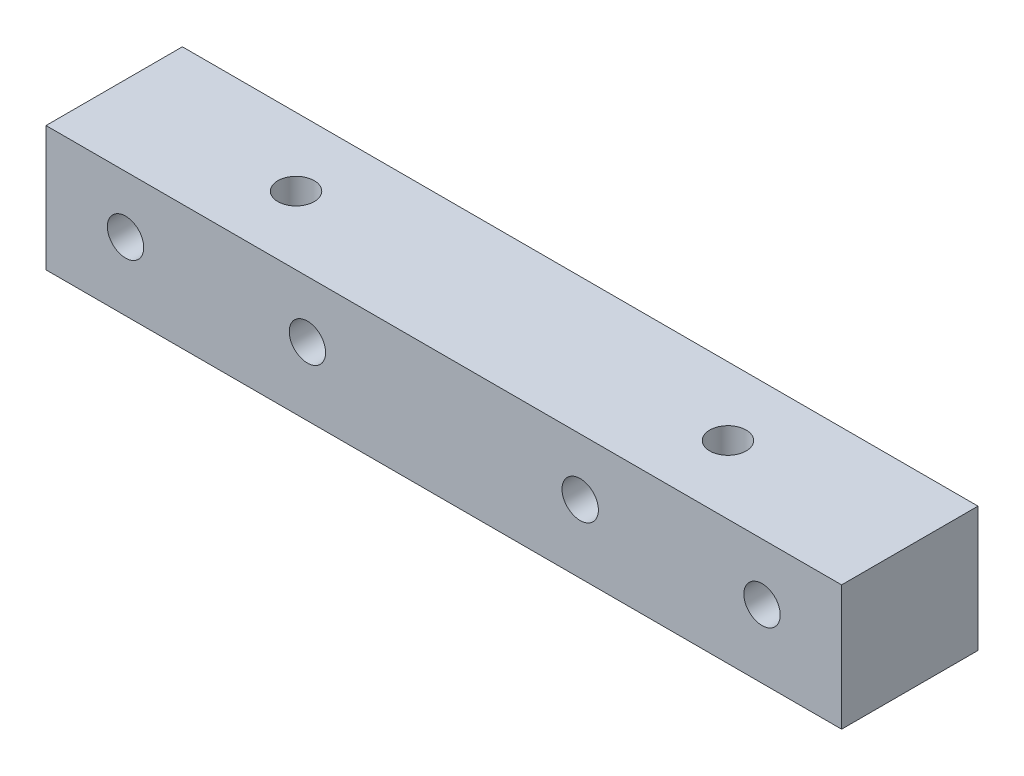
ISO-10303-21;
HEADER;
FILE_DESCRIPTION(('STEP AP214'),'2;1');
FILE_NAME('part.step','',(''),(''),'','','');
FILE_SCHEMA(('AUTOMOTIVE_DESIGN { 1 0 10303 214 1 1 1 1 }'));
ENDSEC;
DATA;
#1=APPLICATION_CONTEXT('core data for automotive mechanical design processes');
#2=APPLICATION_PROTOCOL_DEFINITION('international standard','automotive_design',2000,#1);
#3=PRODUCT_CONTEXT('',#1,'mechanical');
#4=PRODUCT('Part','Part','',(#3));
#5=PRODUCT_RELATED_PRODUCT_CATEGORY('part','',(#4));
#6=PRODUCT_DEFINITION_FORMATION('','',#4);
#7=PRODUCT_DEFINITION_CONTEXT('part definition',#1,'design');
#8=PRODUCT_DEFINITION('design','',#6,#7);
#9=PRODUCT_DEFINITION_SHAPE('','',#8);
#10=(LENGTH_UNIT() NAMED_UNIT(*) SI_UNIT(.MILLI.,.METRE.));
#11=(NAMED_UNIT(*) PLANE_ANGLE_UNIT() SI_UNIT($,.RADIAN.));
#12=(NAMED_UNIT(*) SI_UNIT($,.STERADIAN.) SOLID_ANGLE_UNIT());
#13=UNCERTAINTY_MEASURE_WITH_UNIT(LENGTH_MEASURE(1.E-05),#10,'distance_accuracy_value','');
#14=(GEOMETRIC_REPRESENTATION_CONTEXT(3) GLOBAL_UNCERTAINTY_ASSIGNED_CONTEXT((#13)) GLOBAL_UNIT_ASSIGNED_CONTEXT((#10,
#11,#12)) REPRESENTATION_CONTEXT('',''));
#15=CARTESIAN_POINT('',(0.,0.,0.));
#16=DIRECTION('',(0.,0.,1.));
#17=DIRECTION('',(1.,0.,0.));
#18=AXIS2_PLACEMENT_3D('',#15,#16,#17);
#19=CARTESIAN_POINT('',(-17.5,5.5,3.));
#20=DIRECTION('',(0.,0.,-1.));
#21=DIRECTION('',(-1.,0.,0.));
#22=AXIS2_PLACEMENT_3D('',#19,#20,#21);
#23=PLANE('',#22);
#24=CARTESIAN_POINT('',(6.,3.,3.));
#25=DIRECTION('',(0.,0.,1.));
#26=DIRECTION('',(1.,0.,0.));
#27=AXIS2_PLACEMENT_3D('',#24,#25,#26);
#28=CIRCLE('',#27,0.799999999999999);
#29=CARTESIAN_POINT('',(6.8,3.,3.));
#30=VERTEX_POINT('',#29);
#31=EDGE_CURVE('E132',#30,#30,#28,.T.);
#32=ORIENTED_EDGE('',*,*,#31,.F.);
#33=EDGE_LOOP('',(#32));
#34=FACE_BOUND('',#33,.T.);
#35=CARTESIAN_POINT('',(-14.,3.,3.));
#36=DIRECTION('',(0.,0.,1.));
#37=DIRECTION('',(1.,0.,0.));
#38=AXIS2_PLACEMENT_3D('',#35,#36,#37);
#39=CIRCLE('',#38,0.799999999999999);
#40=CARTESIAN_POINT('',(-13.2,3.,3.));
#41=VERTEX_POINT('',#40);
#42=EDGE_CURVE('E126',#41,#41,#39,.T.);
#43=ORIENTED_EDGE('',*,*,#42,.F.);
#44=EDGE_LOOP('',(#43));
#45=FACE_BOUND('',#44,.T.);
#46=DIRECTION('',(1.,0.,0.));
#47=VECTOR('',#46,1.);
#48=CARTESIAN_POINT('',(-17.5,0.,3.));
#49=LINE('',#48,#47);
#50=CARTESIAN_POINT('',(-17.5,0.,3.));
#51=VERTEX_POINT('',#50);
#52=CARTESIAN_POINT('',(17.5,0.,3.));
#53=VERTEX_POINT('',#52);
#54=EDGE_CURVE('E74',#51,#53,#49,.T.);
#55=ORIENTED_EDGE('',*,*,#54,.T.);
#56=DIRECTION('',(0.,-1.,0.));
#57=VECTOR('',#56,1.);
#58=CARTESIAN_POINT('',(17.5,5.5,3.));
#59=LINE('',#58,#57);
#60=CARTESIAN_POINT('',(17.5,5.5,3.));
#61=VERTEX_POINT('',#60);
#62=EDGE_CURVE('E94',#61,#53,#59,.T.);
#63=ORIENTED_EDGE('',*,*,#62,.F.);
#64=DIRECTION('',(1.,0.,0.));
#65=VECTOR('',#64,1.);
#66=CARTESIAN_POINT('',(-17.5,5.5,3.));
#67=LINE('',#66,#65);
#68=CARTESIAN_POINT('',(-17.5,5.5,3.));
#69=VERTEX_POINT('',#68);
#70=EDGE_CURVE('E51',#69,#61,#67,.T.);
#71=ORIENTED_EDGE('',*,*,#70,.F.);
#72=DIRECTION('',(0.,-1.,0.));
#73=VECTOR('',#72,1.);
#74=CARTESIAN_POINT('',(-17.5,5.5,3.));
#75=LINE('',#74,#73);
#76=EDGE_CURVE('E91',#69,#51,#75,.T.);
#77=ORIENTED_EDGE('',*,*,#76,.T.);
#78=EDGE_LOOP('',(#55,#63,#71,#77));
#79=FACE_BOUND('',#78,.T.);
#80=CARTESIAN_POINT('',(14.,3.,3.));
#81=DIRECTION('',(0.,0.,1.));
#82=DIRECTION('',(1.,0.,0.));
#83=AXIS2_PLACEMENT_3D('',#80,#81,#82);
#84=CIRCLE('',#83,0.799999999999999);
#85=CARTESIAN_POINT('',(14.8,3.,3.));
#86=VERTEX_POINT('',#85);
#87=EDGE_CURVE('E114',#86,#86,#84,.T.);
#88=ORIENTED_EDGE('',*,*,#87,.F.);
#89=EDGE_LOOP('',(#88));
#90=FACE_BOUND('',#89,.T.);
#91=CARTESIAN_POINT('',(-6.,3.,3.));
#92=DIRECTION('',(0.,0.,1.));
#93=DIRECTION('',(1.,0.,0.));
#94=AXIS2_PLACEMENT_3D('',#91,#92,#93);
#95=CIRCLE('',#94,0.799999999999999);
#96=CARTESIAN_POINT('',(-5.2,3.,3.));
#97=VERTEX_POINT('',#96);
#98=EDGE_CURVE('E120',#97,#97,#95,.T.);
#99=ORIENTED_EDGE('',*,*,#98,.F.);
#100=EDGE_LOOP('',(#99));
#101=FACE_BOUND('',#100,.T.);
#102=ADVANCED_FACE('F34',(#34,#45,#79,#90,#101),#23,.F.);
#103=CARTESIAN_POINT('',(17.5,5.5,-3.));
#104=DIRECTION('',(-1.,0.,0.));
#105=DIRECTION('',(0.,0.,1.));
#106=AXIS2_PLACEMENT_3D('',#103,#104,#105);
#107=PLANE('',#106);
#108=DIRECTION('',(0.,0.,-1.));
#109=VECTOR('',#108,1.);
#110=CARTESIAN_POINT('',(17.5,0.,-3.));
#111=LINE('',#110,#109);
#112=CARTESIAN_POINT('',(17.5,0.,-3.));
#113=VERTEX_POINT('',#112);
#114=EDGE_CURVE('E98',#53,#113,#111,.T.);
#115=ORIENTED_EDGE('',*,*,#114,.T.);
#116=DIRECTION('',(0.,-1.,0.));
#117=VECTOR('',#116,1.);
#118=CARTESIAN_POINT('',(17.5,5.5,-3.));
#119=LINE('',#118,#117);
#120=CARTESIAN_POINT('',(17.5,5.5,-3.));
#121=VERTEX_POINT('',#120);
#122=EDGE_CURVE('E11',#121,#113,#119,.T.);
#123=ORIENTED_EDGE('',*,*,#122,.F.);
#124=DIRECTION('',(0.,0.,-1.));
#125=VECTOR('',#124,1.);
#126=CARTESIAN_POINT('',(17.5,5.5,-3.));
#127=LINE('',#126,#125);
#128=EDGE_CURVE('E86',#61,#121,#127,.T.);
#129=ORIENTED_EDGE('',*,*,#128,.F.);
#130=ORIENTED_EDGE('',*,*,#62,.T.);
#131=EDGE_LOOP('',(#115,#123,#129,#130));
#132=FACE_BOUND('',#131,.T.);
#133=ADVANCED_FACE('F36',(#132),#107,.F.);
#134=CARTESIAN_POINT('',(-17.5,5.5,-3.));
#135=DIRECTION('',(0.,0.,1.));
#136=DIRECTION('',(1.,0.,0.));
#137=AXIS2_PLACEMENT_3D('',#134,#135,#136);
#138=PLANE('',#137);
#139=CARTESIAN_POINT('',(6.,3.,-3.));
#140=DIRECTION('',(0.,0.,1.));
#141=DIRECTION('',(1.,0.,0.));
#142=AXIS2_PLACEMENT_3D('',#139,#140,#141);
#143=CIRCLE('',#142,0.799999999999999);
#144=CARTESIAN_POINT('',(6.8,3.,-3.));
#145=VERTEX_POINT('',#144);
#146=EDGE_CURVE('E129',#145,#145,#143,.T.);
#147=ORIENTED_EDGE('',*,*,#146,.T.);
#148=EDGE_LOOP('',(#147));
#149=FACE_BOUND('',#148,.T.);
#150=CARTESIAN_POINT('',(-14.,3.,-3.));
#151=DIRECTION('',(0.,0.,1.));
#152=DIRECTION('',(1.,0.,0.));
#153=AXIS2_PLACEMENT_3D('',#150,#151,#152);
#154=CIRCLE('',#153,0.799999999999999);
#155=CARTESIAN_POINT('',(-13.2,3.,-3.));
#156=VERTEX_POINT('',#155);
#157=EDGE_CURVE('E123',#156,#156,#154,.T.);
#158=ORIENTED_EDGE('',*,*,#157,.T.);
#159=EDGE_LOOP('',(#158));
#160=FACE_BOUND('',#159,.T.);
#161=CARTESIAN_POINT('',(-6.,3.,-3.));
#162=DIRECTION('',(0.,0.,1.));
#163=DIRECTION('',(1.,0.,0.));
#164=AXIS2_PLACEMENT_3D('',#161,#162,#163);
#165=CIRCLE('',#164,0.799999999999999);
#166=CARTESIAN_POINT('',(-5.2,3.,-3.));
#167=VERTEX_POINT('',#166);
#168=EDGE_CURVE('E117',#167,#167,#165,.T.);
#169=ORIENTED_EDGE('',*,*,#168,.T.);
#170=EDGE_LOOP('',(#169));
#171=FACE_BOUND('',#170,.T.);
#172=CARTESIAN_POINT('',(14.,3.,-3.));
#173=DIRECTION('',(0.,0.,1.));
#174=DIRECTION('',(1.,0.,0.));
#175=AXIS2_PLACEMENT_3D('',#172,#173,#174);
#176=CIRCLE('',#175,0.799999999999999);
#177=CARTESIAN_POINT('',(14.8,3.,-3.));
#178=VERTEX_POINT('',#177);
#179=EDGE_CURVE('E101',#178,#178,#176,.T.);
#180=ORIENTED_EDGE('',*,*,#179,.T.);
#181=EDGE_LOOP('',(#180));
#182=FACE_BOUND('',#181,.T.);
#183=DIRECTION('',(-1.,0.,0.));
#184=VECTOR('',#183,1.);
#185=CARTESIAN_POINT('',(-17.5,0.,-3.));
#186=LINE('',#185,#184);
#187=CARTESIAN_POINT('',(-17.5,0.,-3.));
#188=VERTEX_POINT('',#187);
#189=EDGE_CURVE('E90',#113,#188,#186,.T.);
#190=ORIENTED_EDGE('',*,*,#189,.T.);
#191=DIRECTION('',(0.,-1.,0.));
#192=VECTOR('',#191,1.);
#193=CARTESIAN_POINT('',(-17.5,5.5,-3.));
#194=LINE('',#193,#192);
#195=CARTESIAN_POINT('',(-17.5,5.5,-3.));
#196=VERTEX_POINT('',#195);
#197=EDGE_CURVE('E43',#196,#188,#194,.T.);
#198=ORIENTED_EDGE('',*,*,#197,.F.);
#199=DIRECTION('',(-1.,0.,0.));
#200=VECTOR('',#199,1.);
#201=CARTESIAN_POINT('',(-17.5,5.5,-3.));
#202=LINE('',#201,#200);
#203=EDGE_CURVE('E81',#121,#196,#202,.T.);
#204=ORIENTED_EDGE('',*,*,#203,.F.);
#205=ORIENTED_EDGE('',*,*,#122,.T.);
#206=EDGE_LOOP('',(#190,#198,#204,#205));
#207=FACE_BOUND('',#206,.T.);
#208=ADVANCED_FACE('F89',(#149,#160,#171,#182,#207),#138,.F.);
#209=CARTESIAN_POINT('',(-17.5,5.5,-3.));
#210=DIRECTION('',(1.,0.,0.));
#211=DIRECTION('',(0.,0.,-1.));
#212=AXIS2_PLACEMENT_3D('',#209,#210,#211);
#213=PLANE('',#212);
#214=DIRECTION('',(0.,0.,1.));
#215=VECTOR('',#214,1.);
#216=CARTESIAN_POINT('',(-17.5,0.,-3.));
#217=LINE('',#216,#215);
#218=EDGE_CURVE('E68',#188,#51,#217,.T.);
#219=ORIENTED_EDGE('',*,*,#218,.T.);
#220=ORIENTED_EDGE('',*,*,#76,.F.);
#221=DIRECTION('',(0.,0.,1.));
#222=VECTOR('',#221,1.);
#223=CARTESIAN_POINT('',(-17.5,5.5,-3.));
#224=LINE('',#223,#222);
#225=EDGE_CURVE('E84',#196,#69,#224,.T.);
#226=ORIENTED_EDGE('',*,*,#225,.F.);
#227=ORIENTED_EDGE('',*,*,#197,.T.);
#228=EDGE_LOOP('',(#219,#220,#226,#227));
#229=FACE_BOUND('',#228,.T.);
#230=ADVANCED_FACE('F92',(#229),#213,.F.);
#231=CARTESIAN_POINT('',(17.5,5.5,3.));
#232=DIRECTION('',(0.,1.,0.));
#233=DIRECTION('',(0.,0.,1.));
#234=AXIS2_PLACEMENT_3D('',#231,#232,#233);
#235=PLANE('',#234);
#236=CARTESIAN_POINT('',(-9.5,5.5,0.));
#237=DIRECTION('',(0.,1.,0.));
#238=DIRECTION('',(0.,0.,1.));
#239=AXIS2_PLACEMENT_3D('',#236,#237,#238);
#240=CIRCLE('',#239,0.799999999999999);
#241=CARTESIAN_POINT('',(-9.5,5.5,0.799999999999998));
#242=VERTEX_POINT('',#241);
#243=EDGE_CURVE('E144',#242,#242,#240,.T.);
#244=ORIENTED_EDGE('',*,*,#243,.F.);
#245=EDGE_LOOP('',(#244));
#246=FACE_BOUND('',#245,.T.);
#247=CARTESIAN_POINT('',(9.50000000000001,5.5,0.));
#248=DIRECTION('',(0.,1.,0.));
#249=DIRECTION('',(0.,0.,1.));
#250=AXIS2_PLACEMENT_3D('',#247,#248,#249);
#251=CIRCLE('',#250,0.799999999999999);
#252=CARTESIAN_POINT('',(9.50000000000001,5.5,0.799999999999998));
#253=VERTEX_POINT('',#252);
#254=EDGE_CURVE('E138',#253,#253,#251,.T.);
#255=ORIENTED_EDGE('',*,*,#254,.F.);
#256=EDGE_LOOP('',(#255));
#257=FACE_BOUND('',#256,.T.);
#258=ORIENTED_EDGE('',*,*,#128,.T.);
#259=ORIENTED_EDGE('',*,*,#203,.T.);
#260=ORIENTED_EDGE('',*,*,#225,.T.);
#261=ORIENTED_EDGE('',*,*,#70,.T.);
#262=EDGE_LOOP('',(#258,#259,#260,#261));
#263=FACE_BOUND('',#262,.T.);
#264=ADVANCED_FACE('F82',(#246,#257,#263),#235,.T.);
#265=CARTESIAN_POINT('',(17.5,0.,3.));
#266=DIRECTION('',(0.,1.,0.));
#267=DIRECTION('',(0.,0.,1.));
#268=AXIS2_PLACEMENT_3D('',#265,#266,#267);
#269=PLANE('',#268);
#270=CARTESIAN_POINT('',(-9.5,0.,0.));
#271=DIRECTION('',(0.,1.,0.));
#272=DIRECTION('',(0.,0.,1.));
#273=AXIS2_PLACEMENT_3D('',#270,#271,#272);
#274=CIRCLE('',#273,0.799999999999999);
#275=CARTESIAN_POINT('',(-9.5,0.,0.799999999999998));
#276=VERTEX_POINT('',#275);
#277=EDGE_CURVE('E141',#276,#276,#274,.T.);
#278=ORIENTED_EDGE('',*,*,#277,.T.);
#279=EDGE_LOOP('',(#278));
#280=FACE_BOUND('',#279,.T.);
#281=CARTESIAN_POINT('',(9.50000000000001,0.,0.));
#282=DIRECTION('',(0.,1.,0.));
#283=DIRECTION('',(0.,0.,1.));
#284=AXIS2_PLACEMENT_3D('',#281,#282,#283);
#285=CIRCLE('',#284,0.799999999999999);
#286=CARTESIAN_POINT('',(9.50000000000001,0.,0.799999999999998));
#287=VERTEX_POINT('',#286);
#288=EDGE_CURVE('E135',#287,#287,#285,.T.);
#289=ORIENTED_EDGE('',*,*,#288,.T.);
#290=EDGE_LOOP('',(#289));
#291=FACE_BOUND('',#290,.T.);
#292=ORIENTED_EDGE('',*,*,#114,.F.);
#293=ORIENTED_EDGE('',*,*,#54,.F.);
#294=ORIENTED_EDGE('',*,*,#218,.F.);
#295=ORIENTED_EDGE('',*,*,#189,.F.);
#296=EDGE_LOOP('',(#292,#293,#294,#295));
#297=FACE_BOUND('',#296,.T.);
#298=ADVANCED_FACE('F109',(#280,#291,#297),#269,.F.);
#299=CARTESIAN_POINT('',(14.,3.,3.));
#300=DIRECTION('',(0.,0.,1.));
#301=DIRECTION('',(1.,0.,0.));
#302=AXIS2_PLACEMENT_3D('',#299,#300,#301);
#303=CYLINDRICAL_SURFACE('',#302,0.799999999999999);
#304=ORIENTED_EDGE('',*,*,#179,.F.);
#305=EDGE_LOOP('',(#304));
#306=FACE_BOUND('',#305,.T.);
#307=ORIENTED_EDGE('',*,*,#87,.T.);
#308=EDGE_LOOP('',(#307));
#309=FACE_BOUND('',#308,.T.);
#310=ADVANCED_FACE('F193',(#306,#309),#303,.F.);
#311=CARTESIAN_POINT('',(-6.,3.,3.));
#312=DIRECTION('',(0.,0.,1.));
#313=DIRECTION('',(1.,0.,0.));
#314=AXIS2_PLACEMENT_3D('',#311,#312,#313);
#315=CYLINDRICAL_SURFACE('',#314,0.799999999999999);
#316=ORIENTED_EDGE('',*,*,#168,.F.);
#317=EDGE_LOOP('',(#316));
#318=FACE_BOUND('',#317,.T.);
#319=ORIENTED_EDGE('',*,*,#98,.T.);
#320=EDGE_LOOP('',(#319));
#321=FACE_BOUND('',#320,.T.);
#322=ADVANCED_FACE('F196',(#318,#321),#315,.F.);
#323=CARTESIAN_POINT('',(-14.,3.,3.));
#324=DIRECTION('',(0.,0.,1.));
#325=DIRECTION('',(1.,0.,0.));
#326=AXIS2_PLACEMENT_3D('',#323,#324,#325);
#327=CYLINDRICAL_SURFACE('',#326,0.799999999999999);
#328=ORIENTED_EDGE('',*,*,#157,.F.);
#329=EDGE_LOOP('',(#328));
#330=FACE_BOUND('',#329,.T.);
#331=ORIENTED_EDGE('',*,*,#42,.T.);
#332=EDGE_LOOP('',(#331));
#333=FACE_BOUND('',#332,.T.);
#334=ADVANCED_FACE('F166',(#330,#333),#327,.F.);
#335=CARTESIAN_POINT('',(6.,3.,3.));
#336=DIRECTION('',(0.,0.,1.));
#337=DIRECTION('',(1.,0.,0.));
#338=AXIS2_PLACEMENT_3D('',#335,#336,#337);
#339=CYLINDRICAL_SURFACE('',#338,0.799999999999999);
#340=ORIENTED_EDGE('',*,*,#146,.F.);
#341=EDGE_LOOP('',(#340));
#342=FACE_BOUND('',#341,.T.);
#343=ORIENTED_EDGE('',*,*,#31,.T.);
#344=EDGE_LOOP('',(#343));
#345=FACE_BOUND('',#344,.T.);
#346=ADVANCED_FACE('F157',(#342,#345),#339,.F.);
#347=CARTESIAN_POINT('',(9.50000000000001,5.5,0.));
#348=DIRECTION('',(0.,1.,0.));
#349=DIRECTION('',(0.,0.,1.));
#350=AXIS2_PLACEMENT_3D('',#347,#348,#349);
#351=CYLINDRICAL_SURFACE('',#350,0.799999999999999);
#352=ORIENTED_EDGE('',*,*,#288,.F.);
#353=EDGE_LOOP('',(#352));
#354=FACE_BOUND('',#353,.T.);
#355=ORIENTED_EDGE('',*,*,#254,.T.);
#356=EDGE_LOOP('',(#355));
#357=FACE_BOUND('',#356,.T.);
#358=ADVANCED_FACE('F155',(#354,#357),#351,.F.);
#359=CARTESIAN_POINT('',(-9.5,5.5,0.));
#360=DIRECTION('',(0.,1.,0.));
#361=DIRECTION('',(0.,0.,1.));
#362=AXIS2_PLACEMENT_3D('',#359,#360,#361);
#363=CYLINDRICAL_SURFACE('',#362,0.799999999999999);
#364=ORIENTED_EDGE('',*,*,#277,.F.);
#365=EDGE_LOOP('',(#364));
#366=FACE_BOUND('',#365,.T.);
#367=ORIENTED_EDGE('',*,*,#243,.T.);
#368=EDGE_LOOP('',(#367));
#369=FACE_BOUND('',#368,.T.);
#370=ADVANCED_FACE('F148',(#366,#369),#363,.F.);
#371=CLOSED_SHELL('',(#102,#133,#208,#230,#264,#298,#310,#322,#334,#346,#358,#370));
#372=MANIFOLD_SOLID_BREP('B2',#371);
#373=ADVANCED_BREP_SHAPE_REPRESENTATION('',(#18,#372),#14);
#374=SHAPE_DEFINITION_REPRESENTATION(#9,#373);
ENDSEC;
END-ISO-10303-21;
